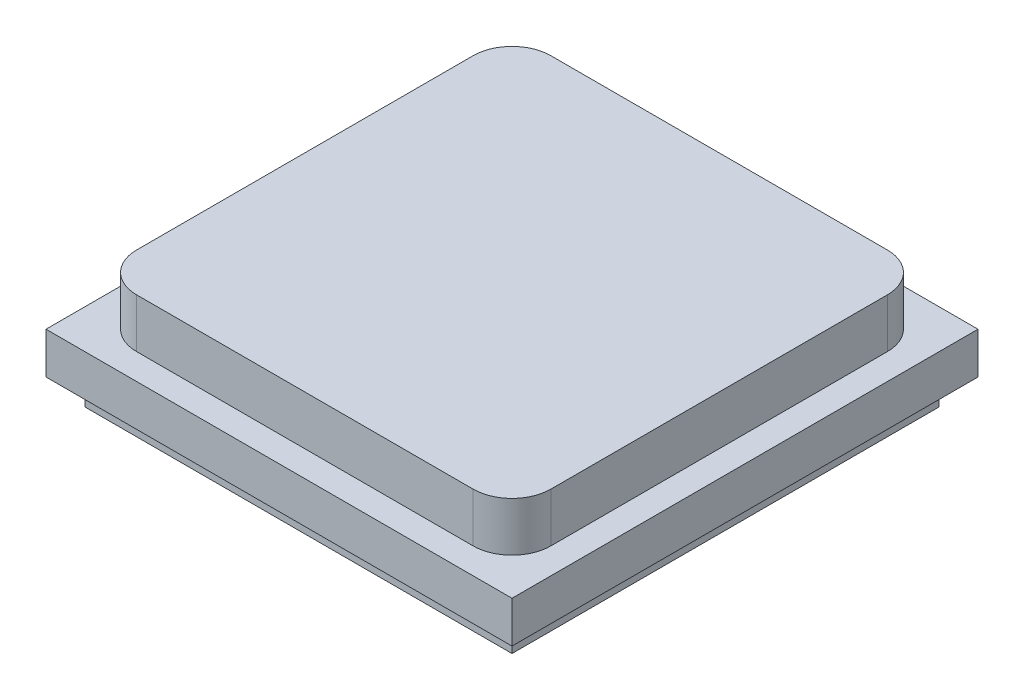
ISO-10303-21;
HEADER;
FILE_DESCRIPTION(('STEP AP214'),'2;1');
FILE_NAME('part.step','',(''),(''),'','','');
FILE_SCHEMA(('AUTOMOTIVE_DESIGN { 1 0 10303 214 1 1 1 1 }'));
ENDSEC;
DATA;
#1=APPLICATION_CONTEXT('core data for automotive mechanical design processes');
#2=APPLICATION_PROTOCOL_DEFINITION('international standard','automotive_design',2000,#1);
#3=PRODUCT_CONTEXT('',#1,'mechanical');
#4=PRODUCT('Part','Part','',(#3));
#5=PRODUCT_RELATED_PRODUCT_CATEGORY('part','',(#4));
#6=PRODUCT_DEFINITION_FORMATION('','',#4);
#7=PRODUCT_DEFINITION_CONTEXT('part definition',#1,'design');
#8=PRODUCT_DEFINITION('design','',#6,#7);
#9=PRODUCT_DEFINITION_SHAPE('','',#8);
#10=(LENGTH_UNIT() NAMED_UNIT(*) SI_UNIT(.MILLI.,.METRE.));
#11=(NAMED_UNIT(*) PLANE_ANGLE_UNIT() SI_UNIT($,.RADIAN.));
#12=(NAMED_UNIT(*) SI_UNIT($,.STERADIAN.) SOLID_ANGLE_UNIT());
#13=UNCERTAINTY_MEASURE_WITH_UNIT(LENGTH_MEASURE(1.E-05),#10,'distance_accuracy_value','');
#14=(GEOMETRIC_REPRESENTATION_CONTEXT(3) GLOBAL_UNCERTAINTY_ASSIGNED_CONTEXT((#13)) GLOBAL_UNIT_ASSIGNED_CONTEXT((#10,
#11,#12)) REPRESENTATION_CONTEXT('',''));
#15=CARTESIAN_POINT('',(0.,0.,0.));
#16=DIRECTION('',(0.,0.,1.));
#17=DIRECTION('',(1.,0.,0.));
#18=AXIS2_PLACEMENT_3D('',#15,#16,#17);
#19=CARTESIAN_POINT('',(0.,0.,0.));
#20=DIRECTION('',(0.,-1.,0.));
#21=DIRECTION('',(0.,0.,-1.));
#22=AXIS2_PLACEMENT_3D('',#19,#20,#21);
#23=PLANE('',#22);
#24=DIRECTION('',(0.,0.,1.));
#25=VECTOR('',#24,1.);
#26=CARTESIAN_POINT('',(-9.,0.,-9.));
#27=LINE('',#26,#25);
#28=CARTESIAN_POINT('',(-9.,0.,-9.));
#29=VERTEX_POINT('',#28);
#30=CARTESIAN_POINT('',(-9.,0.,9.));
#31=VERTEX_POINT('',#30);
#32=EDGE_CURVE('E239',#29,#31,#27,.T.);
#33=ORIENTED_EDGE('',*,*,#32,.F.);
#34=DIRECTION('',(-1.,0.,0.));
#35=VECTOR('',#34,1.);
#36=CARTESIAN_POINT('',(9.,0.,-9.));
#37=LINE('',#36,#35);
#38=CARTESIAN_POINT('',(9.,0.,-9.));
#39=VERTEX_POINT('',#38);
#40=EDGE_CURVE('E263',#39,#29,#37,.T.);
#41=ORIENTED_EDGE('',*,*,#40,.F.);
#42=DIRECTION('',(0.,0.,-1.));
#43=VECTOR('',#42,1.);
#44=CARTESIAN_POINT('',(9.,0.,-9.));
#45=LINE('',#44,#43);
#46=CARTESIAN_POINT('',(9.,0.,9.));
#47=VERTEX_POINT('',#46);
#48=EDGE_CURVE('E274',#47,#39,#45,.T.);
#49=ORIENTED_EDGE('',*,*,#48,.F.);
#50=DIRECTION('',(1.,0.,0.));
#51=VECTOR('',#50,1.);
#52=CARTESIAN_POINT('',(9.,0.,9.));
#53=LINE('',#52,#51);
#54=EDGE_CURVE('E272',#31,#47,#53,.T.);
#55=ORIENTED_EDGE('',*,*,#54,.F.);
#56=EDGE_LOOP('',(#33,#41,#49,#55));
#57=FACE_BOUND('',#56,.T.);
#58=DIRECTION('',(1.,0.,0.));
#59=VECTOR('',#58,1.);
#60=CARTESIAN_POINT('',(-8.25,0.,8.25));
#61=LINE('',#60,#59);
#62=CARTESIAN_POINT('',(-8.25,0.,8.25));
#63=VERTEX_POINT('',#62);
#64=CARTESIAN_POINT('',(8.25,0.,8.25));
#65=VERTEX_POINT('',#64);
#66=EDGE_CURVE('E180',#63,#65,#61,.T.);
#67=ORIENTED_EDGE('',*,*,#66,.T.);
#68=DIRECTION('',(0.,0.,-1.));
#69=VECTOR('',#68,1.);
#70=CARTESIAN_POINT('',(8.25,0.,8.25));
#71=LINE('',#70,#69);
#72=CARTESIAN_POINT('',(8.25,0.,-8.25));
#73=VERTEX_POINT('',#72);
#74=EDGE_CURVE('E60',#65,#73,#71,.T.);
#75=ORIENTED_EDGE('',*,*,#74,.T.);
#76=DIRECTION('',(-1.,0.,0.));
#77=VECTOR('',#76,1.);
#78=CARTESIAN_POINT('',(-8.25,0.,-8.25));
#79=LINE('',#78,#77);
#80=CARTESIAN_POINT('',(-8.25,0.,-8.25));
#81=VERTEX_POINT('',#80);
#82=EDGE_CURVE('E163',#73,#81,#79,.T.);
#83=ORIENTED_EDGE('',*,*,#82,.T.);
#84=DIRECTION('',(0.,0.,1.));
#85=VECTOR('',#84,1.);
#86=CARTESIAN_POINT('',(-8.25,0.,8.25));
#87=LINE('',#86,#85);
#88=EDGE_CURVE('E183',#81,#63,#87,.T.);
#89=ORIENTED_EDGE('',*,*,#88,.T.);
#90=EDGE_LOOP('',(#67,#75,#83,#89));
#91=FACE_BOUND('',#90,.T.);
#92=ADVANCED_FACE('F45',(#57,#91),#23,.T.);
#93=CARTESIAN_POINT('',(-9.,1.6,-9.));
#94=DIRECTION('',(1.,0.,0.));
#95=DIRECTION('',(0.,0.,-1.));
#96=AXIS2_PLACEMENT_3D('',#93,#94,#95);
#97=PLANE('',#96);
#98=ORIENTED_EDGE('',*,*,#32,.T.);
#99=DIRECTION('',(0.,-1.,0.));
#100=VECTOR('',#99,1.);
#101=CARTESIAN_POINT('',(-9.,1.6,9.));
#102=LINE('',#101,#100);
#103=CARTESIAN_POINT('',(-9.,1.6,9.));
#104=VERTEX_POINT('',#103);
#105=EDGE_CURVE('E11',#104,#31,#102,.T.);
#106=ORIENTED_EDGE('',*,*,#105,.F.);
#107=DIRECTION('',(0.,0.,1.));
#108=VECTOR('',#107,1.);
#109=CARTESIAN_POINT('',(-9.,1.6,-9.));
#110=LINE('',#109,#108);
#111=CARTESIAN_POINT('',(-9.,1.6,-9.));
#112=VERTEX_POINT('',#111);
#113=EDGE_CURVE('E259',#112,#104,#110,.T.);
#114=ORIENTED_EDGE('',*,*,#113,.F.);
#115=DIRECTION('',(0.,-1.,0.));
#116=VECTOR('',#115,1.);
#117=CARTESIAN_POINT('',(-9.,1.6,-9.));
#118=LINE('',#117,#116);
#119=EDGE_CURVE('E269',#112,#29,#118,.T.);
#120=ORIENTED_EDGE('',*,*,#119,.T.);
#121=EDGE_LOOP('',(#98,#106,#114,#120));
#122=FACE_BOUND('',#121,.T.);
#123=ADVANCED_FACE('F47',(#122),#97,.F.);
#124=CARTESIAN_POINT('',(9.,1.6,9.));
#125=DIRECTION('',(0.,0.,-1.));
#126=DIRECTION('',(-1.,0.,0.));
#127=AXIS2_PLACEMENT_3D('',#124,#125,#126);
#128=PLANE('',#127);
#129=ORIENTED_EDGE('',*,*,#54,.T.);
#130=DIRECTION('',(0.,-1.,0.));
#131=VECTOR('',#130,1.);
#132=CARTESIAN_POINT('',(9.,1.6,9.));
#133=LINE('',#132,#131);
#134=CARTESIAN_POINT('',(9.,1.6,9.));
#135=VERTEX_POINT('',#134);
#136=EDGE_CURVE('E53',#135,#47,#133,.T.);
#137=ORIENTED_EDGE('',*,*,#136,.F.);
#138=DIRECTION('',(1.,0.,0.));
#139=VECTOR('',#138,1.);
#140=CARTESIAN_POINT('',(9.,1.6,9.));
#141=LINE('',#140,#139);
#142=EDGE_CURVE('E262',#104,#135,#141,.T.);
#143=ORIENTED_EDGE('',*,*,#142,.F.);
#144=ORIENTED_EDGE('',*,*,#105,.T.);
#145=EDGE_LOOP('',(#129,#137,#143,#144));
#146=FACE_BOUND('',#145,.T.);
#147=ADVANCED_FACE('F302',(#146),#128,.F.);
#148=CARTESIAN_POINT('',(9.,1.6,-9.));
#149=DIRECTION('',(-1.,0.,0.));
#150=DIRECTION('',(0.,0.,1.));
#151=AXIS2_PLACEMENT_3D('',#148,#149,#150);
#152=PLANE('',#151);
#153=ORIENTED_EDGE('',*,*,#48,.T.);
#154=DIRECTION('',(0.,-1.,0.));
#155=VECTOR('',#154,1.);
#156=CARTESIAN_POINT('',(9.,1.6,-9.));
#157=LINE('',#156,#155);
#158=CARTESIAN_POINT('',(9.,1.6,-9.));
#159=VERTEX_POINT('',#158);
#160=EDGE_CURVE('E279',#159,#39,#157,.T.);
#161=ORIENTED_EDGE('',*,*,#160,.F.);
#162=DIRECTION('',(0.,0.,-1.));
#163=VECTOR('',#162,1.);
#164=CARTESIAN_POINT('',(9.,1.6,-9.));
#165=LINE('',#164,#163);
#166=EDGE_CURVE('E265',#135,#159,#165,.T.);
#167=ORIENTED_EDGE('',*,*,#166,.F.);
#168=ORIENTED_EDGE('',*,*,#136,.T.);
#169=EDGE_LOOP('',(#153,#161,#167,#168));
#170=FACE_BOUND('',#169,.T.);
#171=ADVANCED_FACE('F286',(#170),#152,.F.);
#172=CARTESIAN_POINT('',(9.,1.6,-9.));
#173=DIRECTION('',(0.,0.,1.));
#174=DIRECTION('',(1.,0.,0.));
#175=AXIS2_PLACEMENT_3D('',#172,#173,#174);
#176=PLANE('',#175);
#177=ORIENTED_EDGE('',*,*,#40,.T.);
#178=ORIENTED_EDGE('',*,*,#119,.F.);
#179=DIRECTION('',(-1.,0.,0.));
#180=VECTOR('',#179,1.);
#181=CARTESIAN_POINT('',(9.,1.6,-9.));
#182=LINE('',#181,#180);
#183=EDGE_CURVE('E267',#159,#112,#182,.T.);
#184=ORIENTED_EDGE('',*,*,#183,.F.);
#185=ORIENTED_EDGE('',*,*,#160,.T.);
#186=EDGE_LOOP('',(#177,#178,#184,#185));
#187=FACE_BOUND('',#186,.T.);
#188=ADVANCED_FACE('F295',(#187),#176,.F.);
#189=CARTESIAN_POINT('',(0.,1.6,0.));
#190=DIRECTION('',(0.,-1.,0.));
#191=DIRECTION('',(0.,0.,-1.));
#192=AXIS2_PLACEMENT_3D('',#189,#190,#191);
#193=PLANE('',#192);
#194=DIRECTION('',(-1.,0.,0.));
#195=VECTOR('',#194,1.);
#196=CARTESIAN_POINT('',(0.,1.6,-8.));
#197=LINE('',#196,#195);
#198=CARTESIAN_POINT('',(6.5,1.6,-8.));
#199=VERTEX_POINT('',#198);
#200=CARTESIAN_POINT('',(-6.50000000000001,1.6,-8.));
#201=VERTEX_POINT('',#200);
#202=EDGE_CURVE('E200',#199,#201,#197,.T.);
#203=ORIENTED_EDGE('',*,*,#202,.F.);
#204=CARTESIAN_POINT('',(6.5,1.6,-6.5));
#205=DIRECTION('',(0.,-1.,0.));
#206=DIRECTION('',(0.,0.,-1.));
#207=AXIS2_PLACEMENT_3D('',#204,#205,#206);
#208=CIRCLE('',#207,1.5);
#209=CARTESIAN_POINT('',(8.,1.6,-6.5));
#210=VERTEX_POINT('',#209);
#211=EDGE_CURVE('E68',#199,#210,#208,.T.);
#212=ORIENTED_EDGE('',*,*,#211,.T.);
#213=DIRECTION('',(0.,0.,-1.));
#214=VECTOR('',#213,1.);
#215=CARTESIAN_POINT('',(8.,1.6,0.));
#216=LINE('',#215,#214);
#217=CARTESIAN_POINT('',(8.,1.6,6.5));
#218=VERTEX_POINT('',#217);
#219=EDGE_CURVE('E219',#218,#210,#216,.T.);
#220=ORIENTED_EDGE('',*,*,#219,.F.);
#221=CARTESIAN_POINT('',(6.5,1.6,6.5));
#222=DIRECTION('',(0.,-1.,0.));
#223=DIRECTION('',(0.,0.,-1.));
#224=AXIS2_PLACEMENT_3D('',#221,#222,#223);
#225=CIRCLE('',#224,1.5);
#226=CARTESIAN_POINT('',(6.5,1.6,8.));
#227=VERTEX_POINT('',#226);
#228=EDGE_CURVE('E222',#218,#227,#225,.T.);
#229=ORIENTED_EDGE('',*,*,#228,.T.);
#230=DIRECTION('',(1.,0.,0.));
#231=VECTOR('',#230,1.);
#232=CARTESIAN_POINT('',(0.,1.6,8.));
#233=LINE('',#232,#231);
#234=CARTESIAN_POINT('',(-6.5,1.6,8.));
#235=VERTEX_POINT('',#234);
#236=EDGE_CURVE('E224',#235,#227,#233,.T.);
#237=ORIENTED_EDGE('',*,*,#236,.F.);
#238=CARTESIAN_POINT('',(-6.5,1.6,6.5));
#239=DIRECTION('',(0.,-1.,0.));
#240=DIRECTION('',(0.,0.,-1.));
#241=AXIS2_PLACEMENT_3D('',#238,#239,#240);
#242=CIRCLE('',#241,1.5);
#243=CARTESIAN_POINT('',(-8.,1.6,6.5));
#244=VERTEX_POINT('',#243);
#245=EDGE_CURVE('E227',#235,#244,#242,.T.);
#246=ORIENTED_EDGE('',*,*,#245,.T.);
#247=DIRECTION('',(0.,0.,1.));
#248=VECTOR('',#247,1.);
#249=CARTESIAN_POINT('',(-8.,1.6,0.));
#250=LINE('',#249,#248);
#251=CARTESIAN_POINT('',(-8.00000000000001,1.6,-6.5));
#252=VERTEX_POINT('',#251);
#253=EDGE_CURVE('E229',#252,#244,#250,.T.);
#254=ORIENTED_EDGE('',*,*,#253,.F.);
#255=CARTESIAN_POINT('',(-6.50000000000001,1.6,-6.5));
#256=DIRECTION('',(0.,-1.,0.));
#257=DIRECTION('',(0.,0.,-1.));
#258=AXIS2_PLACEMENT_3D('',#255,#256,#257);
#259=CIRCLE('',#258,1.5);
#260=EDGE_CURVE('E232',#252,#201,#259,.T.);
#261=ORIENTED_EDGE('',*,*,#260,.T.);
#262=EDGE_LOOP('',(#203,#212,#220,#229,#237,#246,#254,#261));
#263=FACE_BOUND('',#262,.T.);
#264=ORIENTED_EDGE('',*,*,#113,.T.);
#265=ORIENTED_EDGE('',*,*,#142,.T.);
#266=ORIENTED_EDGE('',*,*,#166,.T.);
#267=ORIENTED_EDGE('',*,*,#183,.T.);
#268=EDGE_LOOP('',(#264,#265,#266,#267));
#269=FACE_BOUND('',#268,.T.);
#270=ADVANCED_FACE('F301',(#263,#269),#193,.F.);
#271=CARTESIAN_POINT('',(6.5,3.5,-6.5));
#272=DIRECTION('',(0.,-1.,0.));
#273=DIRECTION('',(0.,0.,-1.));
#274=AXIS2_PLACEMENT_3D('',#271,#272,#273);
#275=CYLINDRICAL_SURFACE('',#274,1.5);
#276=ORIENTED_EDGE('',*,*,#211,.F.);
#277=DIRECTION('',(0.,-1.,0.));
#278=VECTOR('',#277,1.);
#279=CARTESIAN_POINT('',(6.5,3.5,-8.));
#280=LINE('',#279,#278);
#281=CARTESIAN_POINT('',(6.5,3.5,-8.));
#282=VERTEX_POINT('',#281);
#283=EDGE_CURVE('E236',#282,#199,#280,.T.);
#284=ORIENTED_EDGE('',*,*,#283,.F.);
#285=CARTESIAN_POINT('',(6.5,3.5,-6.5));
#286=DIRECTION('',(0.,-1.,0.));
#287=DIRECTION('',(0.,0.,-1.));
#288=AXIS2_PLACEMENT_3D('',#285,#286,#287);
#289=CIRCLE('',#288,1.5);
#290=CARTESIAN_POINT('',(8.,3.5,-6.5));
#291=VERTEX_POINT('',#290);
#292=EDGE_CURVE('E196',#282,#291,#289,.T.);
#293=ORIENTED_EDGE('',*,*,#292,.T.);
#294=DIRECTION('',(0.,-1.,0.));
#295=VECTOR('',#294,1.);
#296=CARTESIAN_POINT('',(8.,3.5,-6.5));
#297=LINE('',#296,#295);
#298=EDGE_CURVE('E217',#291,#210,#297,.T.);
#299=ORIENTED_EDGE('',*,*,#298,.T.);
#300=EDGE_LOOP('',(#276,#284,#293,#299));
#301=FACE_BOUND('',#300,.T.);
#302=ADVANCED_FACE('F320',(#301),#275,.T.);
#303=CARTESIAN_POINT('',(0.,3.5,-8.));
#304=DIRECTION('',(0.,0.,1.));
#305=DIRECTION('',(1.,0.,0.));
#306=AXIS2_PLACEMENT_3D('',#303,#304,#305);
#307=PLANE('',#306);
#308=ORIENTED_EDGE('',*,*,#202,.T.);
#309=DIRECTION('',(0.,-1.,0.));
#310=VECTOR('',#309,1.);
#311=CARTESIAN_POINT('',(-6.50000000000001,3.5,-8.));
#312=LINE('',#311,#310);
#313=CARTESIAN_POINT('',(-6.50000000000001,3.5,-8.));
#314=VERTEX_POINT('',#313);
#315=EDGE_CURVE('E240',#314,#201,#312,.T.);
#316=ORIENTED_EDGE('',*,*,#315,.F.);
#317=DIRECTION('',(-1.,0.,0.));
#318=VECTOR('',#317,1.);
#319=CARTESIAN_POINT('',(0.,3.5,-8.));
#320=LINE('',#319,#318);
#321=EDGE_CURVE('E215',#282,#314,#320,.T.);
#322=ORIENTED_EDGE('',*,*,#321,.F.);
#323=ORIENTED_EDGE('',*,*,#283,.T.);
#324=EDGE_LOOP('',(#308,#316,#322,#323));
#325=FACE_BOUND('',#324,.T.);
#326=ADVANCED_FACE('F324',(#325),#307,.F.);
#327=CARTESIAN_POINT('',(-6.50000000000001,3.5,-6.5));
#328=DIRECTION('',(0.,-1.,0.));
#329=DIRECTION('',(0.,0.,-1.));
#330=AXIS2_PLACEMENT_3D('',#327,#328,#329);
#331=CYLINDRICAL_SURFACE('',#330,1.5);
#332=ORIENTED_EDGE('',*,*,#260,.F.);
#333=DIRECTION('',(0.,-1.,0.));
#334=VECTOR('',#333,1.);
#335=CARTESIAN_POINT('',(-8.00000000000001,3.5,-6.5));
#336=LINE('',#335,#334);
#337=CARTESIAN_POINT('',(-8.00000000000001,3.5,-6.5));
#338=VERTEX_POINT('',#337);
#339=EDGE_CURVE('E243',#338,#252,#336,.T.);
#340=ORIENTED_EDGE('',*,*,#339,.F.);
#341=CARTESIAN_POINT('',(-6.50000000000001,3.5,-6.5));
#342=DIRECTION('',(0.,-1.,0.));
#343=DIRECTION('',(0.,0.,-1.));
#344=AXIS2_PLACEMENT_3D('',#341,#342,#343);
#345=CIRCLE('',#344,1.5);
#346=EDGE_CURVE('E212',#338,#314,#345,.T.);
#347=ORIENTED_EDGE('',*,*,#346,.T.);
#348=ORIENTED_EDGE('',*,*,#315,.T.);
#349=EDGE_LOOP('',(#332,#340,#347,#348));
#350=FACE_BOUND('',#349,.T.);
#351=ADVANCED_FACE('F353',(#350),#331,.T.);
#352=CARTESIAN_POINT('',(-8.,3.5,0.));
#353=DIRECTION('',(1.,0.,0.));
#354=DIRECTION('',(0.,0.,-1.));
#355=AXIS2_PLACEMENT_3D('',#352,#353,#354);
#356=PLANE('',#355);
#357=ORIENTED_EDGE('',*,*,#253,.T.);
#358=DIRECTION('',(0.,-1.,0.));
#359=VECTOR('',#358,1.);
#360=CARTESIAN_POINT('',(-8.,3.5,6.5));
#361=LINE('',#360,#359);
#362=CARTESIAN_POINT('',(-8.,3.5,6.5));
#363=VERTEX_POINT('',#362);
#364=EDGE_CURVE('E246',#363,#244,#361,.T.);
#365=ORIENTED_EDGE('',*,*,#364,.F.);
#366=DIRECTION('',(0.,0.,1.));
#367=VECTOR('',#366,1.);
#368=CARTESIAN_POINT('',(-8.,3.5,0.));
#369=LINE('',#368,#367);
#370=EDGE_CURVE('E210',#338,#363,#369,.T.);
#371=ORIENTED_EDGE('',*,*,#370,.F.);
#372=ORIENTED_EDGE('',*,*,#339,.T.);
#373=EDGE_LOOP('',(#357,#365,#371,#372));
#374=FACE_BOUND('',#373,.T.);
#375=ADVANCED_FACE('F350',(#374),#356,.F.);
#376=CARTESIAN_POINT('',(-6.5,3.5,6.5));
#377=DIRECTION('',(0.,-1.,0.));
#378=DIRECTION('',(0.,0.,-1.));
#379=AXIS2_PLACEMENT_3D('',#376,#377,#378);
#380=CYLINDRICAL_SURFACE('',#379,1.5);
#381=ORIENTED_EDGE('',*,*,#245,.F.);
#382=DIRECTION('',(0.,-1.,0.));
#383=VECTOR('',#382,1.);
#384=CARTESIAN_POINT('',(-6.5,3.5,8.));
#385=LINE('',#384,#383);
#386=CARTESIAN_POINT('',(-6.5,3.5,8.));
#387=VERTEX_POINT('',#386);
#388=EDGE_CURVE('E249',#387,#235,#385,.T.);
#389=ORIENTED_EDGE('',*,*,#388,.F.);
#390=CARTESIAN_POINT('',(-6.5,3.5,6.5));
#391=DIRECTION('',(0.,-1.,0.));
#392=DIRECTION('',(0.,0.,-1.));
#393=AXIS2_PLACEMENT_3D('',#390,#391,#392);
#394=CIRCLE('',#393,1.5);
#395=EDGE_CURVE('E207',#387,#363,#394,.T.);
#396=ORIENTED_EDGE('',*,*,#395,.T.);
#397=ORIENTED_EDGE('',*,*,#364,.T.);
#398=EDGE_LOOP('',(#381,#389,#396,#397));
#399=FACE_BOUND('',#398,.T.);
#400=ADVANCED_FACE('F346',(#399),#380,.T.);
#401=CARTESIAN_POINT('',(0.,3.5,8.));
#402=DIRECTION('',(0.,0.,-1.));
#403=DIRECTION('',(-1.,0.,0.));
#404=AXIS2_PLACEMENT_3D('',#401,#402,#403);
#405=PLANE('',#404);
#406=ORIENTED_EDGE('',*,*,#236,.T.);
#407=DIRECTION('',(0.,-1.,0.));
#408=VECTOR('',#407,1.);
#409=CARTESIAN_POINT('',(6.5,3.5,8.));
#410=LINE('',#409,#408);
#411=CARTESIAN_POINT('',(6.5,3.5,8.));
#412=VERTEX_POINT('',#411);
#413=EDGE_CURVE('E252',#412,#227,#410,.T.);
#414=ORIENTED_EDGE('',*,*,#413,.F.);
#415=DIRECTION('',(1.,0.,0.));
#416=VECTOR('',#415,1.);
#417=CARTESIAN_POINT('',(0.,3.5,8.));
#418=LINE('',#417,#416);
#419=EDGE_CURVE('E205',#387,#412,#418,.T.);
#420=ORIENTED_EDGE('',*,*,#419,.F.);
#421=ORIENTED_EDGE('',*,*,#388,.T.);
#422=EDGE_LOOP('',(#406,#414,#420,#421));
#423=FACE_BOUND('',#422,.T.);
#424=ADVANCED_FACE('F342',(#423),#405,.F.);
#425=CARTESIAN_POINT('',(6.5,3.5,6.5));
#426=DIRECTION('',(0.,-1.,0.));
#427=DIRECTION('',(0.,0.,-1.));
#428=AXIS2_PLACEMENT_3D('',#425,#426,#427);
#429=CYLINDRICAL_SURFACE('',#428,1.5);
#430=ORIENTED_EDGE('',*,*,#228,.F.);
#431=DIRECTION('',(0.,-1.,0.));
#432=VECTOR('',#431,1.);
#433=CARTESIAN_POINT('',(8.,3.5,6.5));
#434=LINE('',#433,#432);
#435=CARTESIAN_POINT('',(8.,3.5,6.5));
#436=VERTEX_POINT('',#435);
#437=EDGE_CURVE('E255',#436,#218,#434,.T.);
#438=ORIENTED_EDGE('',*,*,#437,.F.);
#439=CARTESIAN_POINT('',(6.5,3.5,6.5));
#440=DIRECTION('',(0.,-1.,0.));
#441=DIRECTION('',(0.,0.,-1.));
#442=AXIS2_PLACEMENT_3D('',#439,#440,#441);
#443=CIRCLE('',#442,1.5);
#444=EDGE_CURVE('E202',#436,#412,#443,.T.);
#445=ORIENTED_EDGE('',*,*,#444,.T.);
#446=ORIENTED_EDGE('',*,*,#413,.T.);
#447=EDGE_LOOP('',(#430,#438,#445,#446));
#448=FACE_BOUND('',#447,.T.);
#449=ADVANCED_FACE('F338',(#448),#429,.T.);
#450=CARTESIAN_POINT('',(8.,3.5,0.));
#451=DIRECTION('',(-1.,0.,0.));
#452=DIRECTION('',(0.,0.,1.));
#453=AXIS2_PLACEMENT_3D('',#450,#451,#452);
#454=PLANE('',#453);
#455=ORIENTED_EDGE('',*,*,#219,.T.);
#456=ORIENTED_EDGE('',*,*,#298,.F.);
#457=DIRECTION('',(0.,0.,-1.));
#458=VECTOR('',#457,1.);
#459=CARTESIAN_POINT('',(8.,3.5,0.));
#460=LINE('',#459,#458);
#461=EDGE_CURVE('E199',#436,#291,#460,.T.);
#462=ORIENTED_EDGE('',*,*,#461,.F.);
#463=ORIENTED_EDGE('',*,*,#437,.T.);
#464=EDGE_LOOP('',(#455,#456,#462,#463));
#465=FACE_BOUND('',#464,.T.);
#466=ADVANCED_FACE('F334',(#465),#454,.F.);
#467=CARTESIAN_POINT('',(6.5,3.5,-6.5));
#468=DIRECTION('',(0.,-1.,0.));
#469=DIRECTION('',(0.,0.,-1.));
#470=AXIS2_PLACEMENT_3D('',#467,#468,#469);
#471=PLANE('',#470);
#472=ORIENTED_EDGE('',*,*,#292,.F.);
#473=ORIENTED_EDGE('',*,*,#321,.T.);
#474=ORIENTED_EDGE('',*,*,#346,.F.);
#475=ORIENTED_EDGE('',*,*,#370,.T.);
#476=ORIENTED_EDGE('',*,*,#395,.F.);
#477=ORIENTED_EDGE('',*,*,#419,.T.);
#478=ORIENTED_EDGE('',*,*,#444,.F.);
#479=ORIENTED_EDGE('',*,*,#461,.T.);
#480=EDGE_LOOP('',(#472,#473,#474,#475,#476,#477,#478,#479));
#481=FACE_BOUND('',#480,.T.);
#482=ADVANCED_FACE('F355',(#481),#471,.F.);
#483=CARTESIAN_POINT('',(8.25,-1.,8.25));
#484=DIRECTION('',(1.,0.,0.));
#485=DIRECTION('',(0.,0.,-1.));
#486=AXIS2_PLACEMENT_3D('',#483,#484,#485);
#487=PLANE('',#486);
#488=ORIENTED_EDGE('',*,*,#74,.F.);
#489=DIRECTION('',(0.,1.,0.));
#490=VECTOR('',#489,1.);
#491=CARTESIAN_POINT('',(8.25,-1.,8.25));
#492=LINE('',#491,#490);
#493=CARTESIAN_POINT('',(8.25,-1.,8.25));
#494=VERTEX_POINT('',#493);
#495=EDGE_CURVE('E179',#494,#65,#492,.T.);
#496=ORIENTED_EDGE('',*,*,#495,.F.);
#497=DIRECTION('',(0.,0.,-1.));
#498=VECTOR('',#497,1.);
#499=CARTESIAN_POINT('',(8.25,-1.,8.25));
#500=LINE('',#499,#498);
#501=CARTESIAN_POINT('',(8.25,-1.,-8.25));
#502=VERTEX_POINT('',#501);
#503=EDGE_CURVE('E173',#494,#502,#500,.T.);
#504=ORIENTED_EDGE('',*,*,#503,.T.);
#505=DIRECTION('',(0.,1.,0.));
#506=VECTOR('',#505,1.);
#507=CARTESIAN_POINT('',(8.25,-1.,-8.25));
#508=LINE('',#507,#506);
#509=EDGE_CURVE('E158',#502,#73,#508,.T.);
#510=ORIENTED_EDGE('',*,*,#509,.T.);
#511=EDGE_LOOP('',(#488,#496,#504,#510));
#512=FACE_BOUND('',#511,.T.);
#513=ADVANCED_FACE('F178',(#512),#487,.T.);
#514=CARTESIAN_POINT('',(-8.25,-1.,8.25));
#515=DIRECTION('',(0.,0.,1.));
#516=DIRECTION('',(1.,0.,0.));
#517=AXIS2_PLACEMENT_3D('',#514,#515,#516);
#518=PLANE('',#517);
#519=ORIENTED_EDGE('',*,*,#66,.F.);
#520=DIRECTION('',(0.,1.,0.));
#521=VECTOR('',#520,1.);
#522=CARTESIAN_POINT('',(-8.25,-1.,8.25));
#523=LINE('',#522,#521);
#524=CARTESIAN_POINT('',(-8.25,-1.,8.25));
#525=VERTEX_POINT('',#524);
#526=EDGE_CURVE('E193',#525,#63,#523,.T.);
#527=ORIENTED_EDGE('',*,*,#526,.F.);
#528=DIRECTION('',(1.,0.,0.));
#529=VECTOR('',#528,1.);
#530=CARTESIAN_POINT('',(-8.25,-1.,8.25));
#531=LINE('',#530,#529);
#532=EDGE_CURVE('E166',#525,#494,#531,.T.);
#533=ORIENTED_EDGE('',*,*,#532,.T.);
#534=ORIENTED_EDGE('',*,*,#495,.T.);
#535=EDGE_LOOP('',(#519,#527,#533,#534));
#536=FACE_BOUND('',#535,.T.);
#537=ADVANCED_FACE('F362',(#536),#518,.T.);
#538=CARTESIAN_POINT('',(-8.25,-1.,8.25));
#539=DIRECTION('',(-1.,0.,0.));
#540=DIRECTION('',(0.,0.,1.));
#541=AXIS2_PLACEMENT_3D('',#538,#539,#540);
#542=PLANE('',#541);
#543=ORIENTED_EDGE('',*,*,#88,.F.);
#544=DIRECTION('',(0.,1.,0.));
#545=VECTOR('',#544,1.);
#546=CARTESIAN_POINT('',(-8.25,-1.,-8.25));
#547=LINE('',#546,#545);
#548=CARTESIAN_POINT('',(-8.25,-1.,-8.25));
#549=VERTEX_POINT('',#548);
#550=EDGE_CURVE('E165',#549,#81,#547,.T.);
#551=ORIENTED_EDGE('',*,*,#550,.F.);
#552=DIRECTION('',(0.,0.,1.));
#553=VECTOR('',#552,1.);
#554=CARTESIAN_POINT('',(-8.25,-1.,8.25));
#555=LINE('',#554,#553);
#556=EDGE_CURVE('E176',#549,#525,#555,.T.);
#557=ORIENTED_EDGE('',*,*,#556,.T.);
#558=ORIENTED_EDGE('',*,*,#526,.T.);
#559=EDGE_LOOP('',(#543,#551,#557,#558));
#560=FACE_BOUND('',#559,.T.);
#561=ADVANCED_FACE('F406',(#560),#542,.T.);
#562=CARTESIAN_POINT('',(-8.25,-1.,-8.25));
#563=DIRECTION('',(0.,0.,-1.));
#564=DIRECTION('',(-1.,0.,0.));
#565=AXIS2_PLACEMENT_3D('',#562,#563,#564);
#566=PLANE('',#565);
#567=ORIENTED_EDGE('',*,*,#82,.F.);
#568=ORIENTED_EDGE('',*,*,#509,.F.);
#569=DIRECTION('',(-1.,0.,0.));
#570=VECTOR('',#569,1.);
#571=CARTESIAN_POINT('',(-8.25,-1.,-8.25));
#572=LINE('',#571,#570);
#573=EDGE_CURVE('E161',#502,#549,#572,.T.);
#574=ORIENTED_EDGE('',*,*,#573,.T.);
#575=ORIENTED_EDGE('',*,*,#550,.T.);
#576=EDGE_LOOP('',(#567,#568,#574,#575));
#577=FACE_BOUND('',#576,.T.);
#578=ADVANCED_FACE('F160',(#577),#566,.T.);
#579=CARTESIAN_POINT('',(0.,-1.,0.));
#580=DIRECTION('',(0.,-1.,0.));
#581=DIRECTION('',(0.,0.,-1.));
#582=AXIS2_PLACEMENT_3D('',#579,#580,#581);
#583=PLANE('',#582);
#584=ORIENTED_EDGE('',*,*,#503,.F.);
#585=ORIENTED_EDGE('',*,*,#532,.F.);
#586=ORIENTED_EDGE('',*,*,#556,.F.);
#587=ORIENTED_EDGE('',*,*,#573,.F.);
#588=EDGE_LOOP('',(#584,#585,#586,#587));
#589=FACE_BOUND('',#588,.T.);
#590=ADVANCED_FACE('F171',(#589),#583,.T.);
#591=CLOSED_SHELL('',(#92,#123,#147,#171,#188,#270,#302,#326,#351,#375,#400,#424,#449,#466,#482,
#513,#537,#561,#578,#590));
#592=MANIFOLD_SOLID_BREP('B2',#591);
#593=ADVANCED_BREP_SHAPE_REPRESENTATION('',(#18,#592),#14);
#594=SHAPE_DEFINITION_REPRESENTATION(#9,#593);
ENDSEC;
END-ISO-10303-21;
